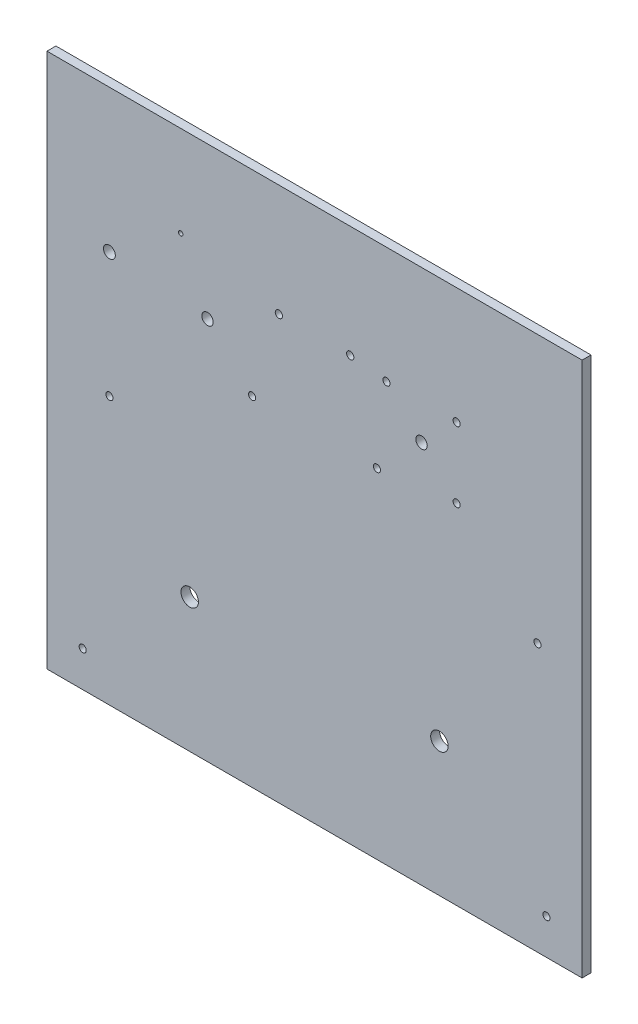
ISO-10303-21;
HEADER;
FILE_DESCRIPTION(('STEP AP214'),'2;1');
FILE_NAME('part.step','',(''),(''),'','','');
FILE_SCHEMA(('AUTOMOTIVE_DESIGN { 1 0 10303 214 1 1 1 1 }'));
ENDSEC;
DATA;
#1=APPLICATION_CONTEXT('core data for automotive mechanical design processes');
#2=APPLICATION_PROTOCOL_DEFINITION('international standard','automotive_design',2000,#1);
#3=PRODUCT_CONTEXT('',#1,'mechanical');
#4=PRODUCT('Part','Part','',(#3));
#5=PRODUCT_RELATED_PRODUCT_CATEGORY('part','',(#4));
#6=PRODUCT_DEFINITION_FORMATION('','',#4);
#7=PRODUCT_DEFINITION_CONTEXT('part definition',#1,'design');
#8=PRODUCT_DEFINITION('design','',#6,#7);
#9=PRODUCT_DEFINITION_SHAPE('','',#8);
#10=(LENGTH_UNIT() NAMED_UNIT(*) SI_UNIT(.MILLI.,.METRE.));
#11=(NAMED_UNIT(*) PLANE_ANGLE_UNIT() SI_UNIT($,.RADIAN.));
#12=(NAMED_UNIT(*) SI_UNIT($,.STERADIAN.) SOLID_ANGLE_UNIT());
#13=UNCERTAINTY_MEASURE_WITH_UNIT(LENGTH_MEASURE(1.E-05),#10,'distance_accuracy_value','');
#14=(GEOMETRIC_REPRESENTATION_CONTEXT(3) GLOBAL_UNCERTAINTY_ASSIGNED_CONTEXT((#13)) GLOBAL_UNIT_ASSIGNED_CONTEXT((#10,
#11,#12)) REPRESENTATION_CONTEXT('',''));
#15=CARTESIAN_POINT('',(0.,0.,0.));
#16=DIRECTION('',(0.,0.,1.));
#17=DIRECTION('',(1.,0.,0.));
#18=AXIS2_PLACEMENT_3D('',#15,#16,#17);
#19=CARTESIAN_POINT('',(190.5,0.,6.35));
#20=DIRECTION('',(0.,0.,1.));
#21=DIRECTION('',(1.,0.,0.));
#22=AXIS2_PLACEMENT_3D('',#19,#20,#21);
#23=PLANE('',#22);
#24=CARTESIAN_POINT('',(-146.05,279.4,6.35));
#25=DIRECTION('',(0.,0.,1.));
#26=DIRECTION('',(1.,0.,0.));
#27=AXIS2_PLACEMENT_3D('',#24,#25,#26);
#28=CIRCLE('',#27,4.21639999999998);
#29=CARTESIAN_POINT('',(-141.8336,279.4,6.35));
#30=VERTEX_POINT('',#29);
#31=EDGE_CURVE('E212',#30,#30,#28,.T.);
#32=ORIENTED_EDGE('',*,*,#31,.F.);
#33=EDGE_LOOP('',(#32));
#34=FACE_BOUND('',#33,.T.);
#35=CARTESIAN_POINT('',(51.1999999999998,298.05,6.35));
#36=DIRECTION('',(0.,0.,1.));
#37=DIRECTION('',(1.,0.,0.));
#38=AXIS2_PLACEMENT_3D('',#35,#36,#37);
#39=CIRCLE('',#38,2.53999999999996);
#40=CARTESIAN_POINT('',(53.7399999999997,298.05,6.35));
#41=VERTEX_POINT('',#40);
#42=EDGE_CURVE('E195',#41,#41,#39,.T.);
#43=ORIENTED_EDGE('',*,*,#42,.F.);
#44=EDGE_LOOP('',(#43));
#45=FACE_BOUND('',#44,.T.);
#46=CARTESIAN_POINT('',(-44.45,241.3,6.35));
#47=DIRECTION('',(0.,0.,1.));
#48=DIRECTION('',(-1.,0.,0.));
#49=AXIS2_PLACEMENT_3D('',#46,#47,#48);
#50=CIRCLE('',#49,2.54000000000002);
#51=CARTESIAN_POINT('',(-46.99,241.3,6.35));
#52=VERTEX_POINT('',#51);
#53=EDGE_CURVE('E183',#52,#52,#50,.T.);
#54=ORIENTED_EDGE('',*,*,#53,.F.);
#55=EDGE_LOOP('',(#54));
#56=FACE_BOUND('',#55,.T.);
#57=CARTESIAN_POINT('',(-146.05,190.5,6.35));
#58=DIRECTION('',(0.,0.,1.));
#59=DIRECTION('',(-1.,0.,0.));
#60=AXIS2_PLACEMENT_3D('',#57,#58,#59);
#61=CIRCLE('',#60,2.53999999999995);
#62=CARTESIAN_POINT('',(-148.59,190.5,6.35));
#63=VERTEX_POINT('',#62);
#64=EDGE_CURVE('E171',#63,#63,#61,.T.);
#65=ORIENTED_EDGE('',*,*,#64,.F.);
#66=EDGE_LOOP('',(#65));
#67=FACE_BOUND('',#66,.T.);
#68=CARTESIAN_POINT('',(158.75,190.5,6.35));
#69=DIRECTION('',(0.,0.,1.));
#70=DIRECTION('',(1.,0.,0.));
#71=AXIS2_PLACEMENT_3D('',#68,#69,#70);
#72=CIRCLE('',#71,2.53999999999998);
#73=CARTESIAN_POINT('',(161.29,190.5,6.35));
#74=VERTEX_POINT('',#73);
#75=EDGE_CURVE('E159',#74,#74,#72,.T.);
#76=ORIENTED_EDGE('',*,*,#75,.F.);
#77=EDGE_LOOP('',(#76));
#78=FACE_BOUND('',#77,.T.);
#79=CARTESIAN_POINT('',(101.2,298.05,6.35));
#80=DIRECTION('',(0.,0.,1.));
#81=DIRECTION('',(1.,0.,0.));
#82=AXIS2_PLACEMENT_3D('',#79,#80,#81);
#83=CIRCLE('',#82,2.53999999999998);
#84=CARTESIAN_POINT('',(103.74,298.05,6.35));
#85=VERTEX_POINT('',#84);
#86=EDGE_CURVE('E147',#85,#85,#83,.T.);
#87=ORIENTED_EDGE('',*,*,#86,.F.);
#88=EDGE_LOOP('',(#87));
#89=FACE_BOUND('',#88,.T.);
#90=CARTESIAN_POINT('',(44.4500000000001,241.3,6.35));
#91=DIRECTION('',(0.,0.,1.));
#92=DIRECTION('',(1.,0.,0.));
#93=AXIS2_PLACEMENT_3D('',#90,#91,#92);
#94=CIRCLE('',#93,2.54000000000002);
#95=CARTESIAN_POINT('',(46.9900000000001,241.3,6.35));
#96=VERTEX_POINT('',#95);
#97=EDGE_CURVE('E135',#96,#96,#94,.T.);
#98=ORIENTED_EDGE('',*,*,#97,.F.);
#99=EDGE_LOOP('',(#98));
#100=FACE_BOUND('',#99,.T.);
#101=CARTESIAN_POINT('',(76.1999999999998,273.05,6.35));
#102=DIRECTION('',(0.,0.,1.));
#103=DIRECTION('',(1.,0.,0.));
#104=AXIS2_PLACEMENT_3D('',#101,#102,#103);
#105=CIRCLE('',#104,4.06400000000001);
#106=CARTESIAN_POINT('',(80.2639999999998,273.05,6.35));
#107=VERTEX_POINT('',#106);
#108=EDGE_CURVE('E123',#107,#107,#105,.T.);
#109=ORIENTED_EDGE('',*,*,#108,.F.);
#110=EDGE_LOOP('',(#109));
#111=FACE_BOUND('',#110,.T.);
#112=CARTESIAN_POINT('',(-25.4,301.364999999996,6.35));
#113=DIRECTION('',(0.,0.,1.));
#114=DIRECTION('',(1.,0.,0.));
#115=AXIS2_PLACEMENT_3D('',#112,#113,#114);
#116=CIRCLE('',#115,2.5796875);
#117=CARTESIAN_POINT('',(-22.8203125,301.364999999996,6.35));
#118=VERTEX_POINT('',#117);
#119=EDGE_CURVE('E102',#118,#118,#116,.T.);
#120=ORIENTED_EDGE('',*,*,#119,.F.);
#121=EDGE_LOOP('',(#120));
#122=FACE_BOUND('',#121,.T.);
#123=DIRECTION('',(0.,1.,0.));
#124=VECTOR('',#123,1.);
#125=CARTESIAN_POINT('',(190.5,381.,6.35));
#126=LINE('',#125,#124);
#127=CARTESIAN_POINT('',(190.5,0.,6.35));
#128=VERTEX_POINT('',#127);
#129=CARTESIAN_POINT('',(190.5,381.,6.35));
#130=VERTEX_POINT('',#129);
#131=EDGE_CURVE('E87',#128,#130,#126,.T.);
#132=ORIENTED_EDGE('',*,*,#131,.T.);
#133=DIRECTION('',(-1.,0.,0.));
#134=VECTOR('',#133,1.);
#135=CARTESIAN_POINT('',(190.5,381.,6.35));
#136=LINE('',#135,#134);
#137=CARTESIAN_POINT('',(-190.5,381.,6.35));
#138=VERTEX_POINT('',#137);
#139=EDGE_CURVE('E82',#130,#138,#136,.T.);
#140=ORIENTED_EDGE('',*,*,#139,.T.);
#141=DIRECTION('',(0.,-1.,0.));
#142=VECTOR('',#141,1.);
#143=CARTESIAN_POINT('',(-190.5,381.,6.35));
#144=LINE('',#143,#142);
#145=CARTESIAN_POINT('',(-190.5,0.,6.35));
#146=VERTEX_POINT('',#145);
#147=EDGE_CURVE('E85',#138,#146,#144,.T.);
#148=ORIENTED_EDGE('',*,*,#147,.T.);
#149=DIRECTION('',(1.,0.,0.));
#150=VECTOR('',#149,1.);
#151=CARTESIAN_POINT('',(-190.5,0.,6.35));
#152=LINE('',#151,#150);
#153=EDGE_CURVE('E52',#146,#128,#152,.T.);
#154=ORIENTED_EDGE('',*,*,#153,.T.);
#155=EDGE_LOOP('',(#132,#140,#148,#154));
#156=FACE_BOUND('',#155,.T.);
#157=CARTESIAN_POINT('',(25.4,301.364999999996,6.35));
#158=DIRECTION('',(0.,0.,1.));
#159=DIRECTION('',(1.,0.,0.));
#160=AXIS2_PLACEMENT_3D('',#157,#158,#159);
#161=CIRCLE('',#160,2.57968749999999);
#162=CARTESIAN_POINT('',(27.9796875,301.364999999996,6.35));
#163=VERTEX_POINT('',#162);
#164=EDGE_CURVE('E117',#163,#163,#161,.T.);
#165=ORIENTED_EDGE('',*,*,#164,.F.);
#166=EDGE_LOOP('',(#165));
#167=FACE_BOUND('',#166,.T.);
#168=CARTESIAN_POINT('',(88.9000000000001,95.2499999999999,6.35));
#169=DIRECTION('',(0.,0.,1.));
#170=DIRECTION('',(1.,0.,0.));
#171=AXIS2_PLACEMENT_3D('',#168,#169,#170);
#172=CIRCLE('',#171,6.22299999999999);
#173=CARTESIAN_POINT('',(95.1230000000001,95.2499999999999,6.35));
#174=VERTEX_POINT('',#173);
#175=EDGE_CURVE('E129',#174,#174,#172,.T.);
#176=ORIENTED_EDGE('',*,*,#175,.F.);
#177=EDGE_LOOP('',(#176));
#178=FACE_BOUND('',#177,.T.);
#179=CARTESIAN_POINT('',(-165.1,25.3999999999985,6.35));
#180=DIRECTION('',(0.,0.,1.));
#181=DIRECTION('',(-1.,0.,0.));
#182=AXIS2_PLACEMENT_3D('',#179,#180,#181);
#183=CIRCLE('',#182,2.53999999999998);
#184=CARTESIAN_POINT('',(-167.64,25.3999999999985,6.35));
#185=VERTEX_POINT('',#184);
#186=EDGE_CURVE('E141',#185,#185,#183,.T.);
#187=ORIENTED_EDGE('',*,*,#186,.F.);
#188=EDGE_LOOP('',(#187));
#189=FACE_BOUND('',#188,.T.);
#190=CARTESIAN_POINT('',(165.1,25.3999999999986,6.35));
#191=DIRECTION('',(0.,0.,1.));
#192=DIRECTION('',(1.,0.,0.));
#193=AXIS2_PLACEMENT_3D('',#190,#191,#192);
#194=CIRCLE('',#193,2.53999999999998);
#195=CARTESIAN_POINT('',(167.64,25.3999999999986,6.35));
#196=VERTEX_POINT('',#195);
#197=EDGE_CURVE('E153',#196,#196,#194,.T.);
#198=ORIENTED_EDGE('',*,*,#197,.F.);
#199=EDGE_LOOP('',(#198));
#200=FACE_BOUND('',#199,.T.);
#201=CARTESIAN_POINT('',(-88.9,95.2499999999999,6.35));
#202=DIRECTION('',(0.,0.,1.));
#203=DIRECTION('',(-1.,0.,0.));
#204=AXIS2_PLACEMENT_3D('',#201,#202,#203);
#205=CIRCLE('',#204,6.22299999999999);
#206=CARTESIAN_POINT('',(-95.123,95.2499999999999,6.35));
#207=VERTEX_POINT('',#206);
#208=EDGE_CURVE('E165',#207,#207,#205,.T.);
#209=ORIENTED_EDGE('',*,*,#208,.F.);
#210=EDGE_LOOP('',(#209));
#211=FACE_BOUND('',#210,.T.);
#212=CARTESIAN_POINT('',(101.2,248.05,6.35));
#213=DIRECTION('',(0.,0.,1.));
#214=DIRECTION('',(1.,0.,0.));
#215=AXIS2_PLACEMENT_3D('',#212,#213,#214);
#216=CIRCLE('',#215,2.53999999999998);
#217=CARTESIAN_POINT('',(103.74,248.05,6.35));
#218=VERTEX_POINT('',#217);
#219=EDGE_CURVE('E177',#218,#218,#216,.T.);
#220=ORIENTED_EDGE('',*,*,#219,.F.);
#221=EDGE_LOOP('',(#220));
#222=FACE_BOUND('',#221,.T.);
#223=CARTESIAN_POINT('',(-76.2,273.05,6.35));
#224=DIRECTION('',(0.,0.,1.));
#225=DIRECTION('',(-1.,0.,0.));
#226=AXIS2_PLACEMENT_3D('',#223,#224,#225);
#227=CIRCLE('',#226,4.06400000000001);
#228=CARTESIAN_POINT('',(-80.264,273.05,6.35));
#229=VERTEX_POINT('',#228);
#230=EDGE_CURVE('E189',#229,#229,#227,.T.);
#231=ORIENTED_EDGE('',*,*,#230,.F.);
#232=EDGE_LOOP('',(#231));
#233=FACE_BOUND('',#232,.T.);
#234=CARTESIAN_POINT('',(-95.25,316.23,6.35));
#235=DIRECTION('',(0.,0.,1.));
#236=DIRECTION('',(1.,0.,0.));
#237=AXIS2_PLACEMENT_3D('',#234,#235,#236);
#238=CIRCLE('',#237,1.5875);
#239=CARTESIAN_POINT('',(-93.6625,316.23,6.35));
#240=VERTEX_POINT('',#239);
#241=EDGE_CURVE('E201',#240,#240,#238,.T.);
#242=ORIENTED_EDGE('',*,*,#241,.F.);
#243=EDGE_LOOP('',(#242));
#244=FACE_BOUND('',#243,.T.);
#245=ADVANCED_FACE('F35',(#34,#45,#56,#67,#78,#89,#100,#111,#122,#156,#167,#178,#189,#200,#211,
#222,#233,#244),#23,.T.);
#246=CARTESIAN_POINT('',(190.5,0.,0.));
#247=DIRECTION('',(0.,0.,1.));
#248=DIRECTION('',(1.,0.,0.));
#249=AXIS2_PLACEMENT_3D('',#246,#247,#248);
#250=PLANE('',#249);
#251=CARTESIAN_POINT('',(-146.05,279.4,0.));
#252=DIRECTION('',(0.,0.,1.));
#253=DIRECTION('',(1.,0.,0.));
#254=AXIS2_PLACEMENT_3D('',#251,#252,#253);
#255=CIRCLE('',#254,4.21640000000001);
#256=CARTESIAN_POINT('',(-141.8336,279.4,0.));
#257=VERTEX_POINT('',#256);
#258=EDGE_CURVE('E207',#257,#257,#255,.T.);
#259=ORIENTED_EDGE('',*,*,#258,.T.);
#260=EDGE_LOOP('',(#259));
#261=FACE_BOUND('',#260,.T.);
#262=CARTESIAN_POINT('',(51.1999999999998,298.05,0.));
#263=DIRECTION('',(0.,0.,1.));
#264=DIRECTION('',(1.,0.,0.));
#265=AXIS2_PLACEMENT_3D('',#262,#263,#264);
#266=CIRCLE('',#265,2.53999999999996);
#267=CARTESIAN_POINT('',(53.7399999999997,298.05,0.));
#268=VERTEX_POINT('',#267);
#269=EDGE_CURVE('E198',#268,#268,#266,.T.);
#270=ORIENTED_EDGE('',*,*,#269,.T.);
#271=EDGE_LOOP('',(#270));
#272=FACE_BOUND('',#271,.T.);
#273=CARTESIAN_POINT('',(-44.45,241.3,0.));
#274=DIRECTION('',(0.,0.,1.));
#275=DIRECTION('',(-1.,0.,0.));
#276=AXIS2_PLACEMENT_3D('',#273,#274,#275);
#277=CIRCLE('',#276,2.54000000000002);
#278=CARTESIAN_POINT('',(-46.99,241.3,0.));
#279=VERTEX_POINT('',#278);
#280=EDGE_CURVE('E186',#279,#279,#277,.T.);
#281=ORIENTED_EDGE('',*,*,#280,.T.);
#282=EDGE_LOOP('',(#281));
#283=FACE_BOUND('',#282,.T.);
#284=CARTESIAN_POINT('',(-146.05,190.5,0.));
#285=DIRECTION('',(0.,0.,1.));
#286=DIRECTION('',(-1.,0.,0.));
#287=AXIS2_PLACEMENT_3D('',#284,#285,#286);
#288=CIRCLE('',#287,2.53999999999995);
#289=CARTESIAN_POINT('',(-148.59,190.5,0.));
#290=VERTEX_POINT('',#289);
#291=EDGE_CURVE('E174',#290,#290,#288,.T.);
#292=ORIENTED_EDGE('',*,*,#291,.T.);
#293=EDGE_LOOP('',(#292));
#294=FACE_BOUND('',#293,.T.);
#295=CARTESIAN_POINT('',(158.75,190.5,0.));
#296=DIRECTION('',(0.,0.,1.));
#297=DIRECTION('',(1.,0.,0.));
#298=AXIS2_PLACEMENT_3D('',#295,#296,#297);
#299=CIRCLE('',#298,2.53999999999998);
#300=CARTESIAN_POINT('',(161.29,190.5,0.));
#301=VERTEX_POINT('',#300);
#302=EDGE_CURVE('E162',#301,#301,#299,.T.);
#303=ORIENTED_EDGE('',*,*,#302,.T.);
#304=EDGE_LOOP('',(#303));
#305=FACE_BOUND('',#304,.T.);
#306=CARTESIAN_POINT('',(101.2,298.05,0.));
#307=DIRECTION('',(0.,0.,1.));
#308=DIRECTION('',(1.,0.,0.));
#309=AXIS2_PLACEMENT_3D('',#306,#307,#308);
#310=CIRCLE('',#309,2.53999999999998);
#311=CARTESIAN_POINT('',(103.74,298.05,0.));
#312=VERTEX_POINT('',#311);
#313=EDGE_CURVE('E150',#312,#312,#310,.T.);
#314=ORIENTED_EDGE('',*,*,#313,.T.);
#315=EDGE_LOOP('',(#314));
#316=FACE_BOUND('',#315,.T.);
#317=CARTESIAN_POINT('',(44.4500000000001,241.3,0.));
#318=DIRECTION('',(0.,0.,1.));
#319=DIRECTION('',(1.,0.,0.));
#320=AXIS2_PLACEMENT_3D('',#317,#318,#319);
#321=CIRCLE('',#320,2.54000000000002);
#322=CARTESIAN_POINT('',(46.9900000000001,241.3,0.));
#323=VERTEX_POINT('',#322);
#324=EDGE_CURVE('E138',#323,#323,#321,.T.);
#325=ORIENTED_EDGE('',*,*,#324,.T.);
#326=EDGE_LOOP('',(#325));
#327=FACE_BOUND('',#326,.T.);
#328=CARTESIAN_POINT('',(76.1999999999998,273.05,0.));
#329=DIRECTION('',(0.,0.,1.));
#330=DIRECTION('',(1.,0.,0.));
#331=AXIS2_PLACEMENT_3D('',#328,#329,#330);
#332=CIRCLE('',#331,4.06400000000001);
#333=CARTESIAN_POINT('',(80.2639999999998,273.05,0.));
#334=VERTEX_POINT('',#333);
#335=EDGE_CURVE('E126',#334,#334,#332,.T.);
#336=ORIENTED_EDGE('',*,*,#335,.T.);
#337=EDGE_LOOP('',(#336));
#338=FACE_BOUND('',#337,.T.);
#339=CARTESIAN_POINT('',(-25.4,301.364999999996,0.));
#340=DIRECTION('',(0.,0.,1.));
#341=DIRECTION('',(1.,0.,0.));
#342=AXIS2_PLACEMENT_3D('',#339,#340,#341);
#343=CIRCLE('',#342,2.5796875);
#344=CARTESIAN_POINT('',(-22.8203125,301.364999999996,0.));
#345=VERTEX_POINT('',#344);
#346=EDGE_CURVE('E114',#345,#345,#343,.T.);
#347=ORIENTED_EDGE('',*,*,#346,.T.);
#348=EDGE_LOOP('',(#347));
#349=FACE_BOUND('',#348,.T.);
#350=DIRECTION('',(0.,1.,0.));
#351=VECTOR('',#350,1.);
#352=CARTESIAN_POINT('',(190.5,381.,0.));
#353=LINE('',#352,#351);
#354=CARTESIAN_POINT('',(190.5,0.,0.));
#355=VERTEX_POINT('',#354);
#356=CARTESIAN_POINT('',(190.5,381.,0.));
#357=VERTEX_POINT('',#356);
#358=EDGE_CURVE('E99',#355,#357,#353,.T.);
#359=ORIENTED_EDGE('',*,*,#358,.F.);
#360=DIRECTION('',(1.,0.,0.));
#361=VECTOR('',#360,1.);
#362=CARTESIAN_POINT('',(-190.5,0.,0.));
#363=LINE('',#362,#361);
#364=CARTESIAN_POINT('',(-190.5,0.,0.));
#365=VERTEX_POINT('',#364);
#366=EDGE_CURVE('E75',#365,#355,#363,.T.);
#367=ORIENTED_EDGE('',*,*,#366,.F.);
#368=DIRECTION('',(0.,-1.,0.));
#369=VECTOR('',#368,1.);
#370=CARTESIAN_POINT('',(-190.5,381.,0.));
#371=LINE('',#370,#369);
#372=CARTESIAN_POINT('',(-190.5,381.,0.));
#373=VERTEX_POINT('',#372);
#374=EDGE_CURVE('E69',#373,#365,#371,.T.);
#375=ORIENTED_EDGE('',*,*,#374,.F.);
#376=DIRECTION('',(-1.,0.,0.));
#377=VECTOR('',#376,1.);
#378=CARTESIAN_POINT('',(190.5,381.,0.));
#379=LINE('',#378,#377);
#380=EDGE_CURVE('E91',#357,#373,#379,.T.);
#381=ORIENTED_EDGE('',*,*,#380,.F.);
#382=EDGE_LOOP('',(#359,#367,#375,#381));
#383=FACE_BOUND('',#382,.T.);
#384=CARTESIAN_POINT('',(25.4,301.364999999996,0.));
#385=DIRECTION('',(0.,0.,1.));
#386=DIRECTION('',(1.,0.,0.));
#387=AXIS2_PLACEMENT_3D('',#384,#385,#386);
#388=CIRCLE('',#387,2.57968749999999);
#389=CARTESIAN_POINT('',(27.9796875,301.364999999996,0.));
#390=VERTEX_POINT('',#389);
#391=EDGE_CURVE('E120',#390,#390,#388,.T.);
#392=ORIENTED_EDGE('',*,*,#391,.T.);
#393=EDGE_LOOP('',(#392));
#394=FACE_BOUND('',#393,.T.);
#395=CARTESIAN_POINT('',(88.9000000000001,95.2499999999999,0.));
#396=DIRECTION('',(0.,0.,1.));
#397=DIRECTION('',(1.,0.,0.));
#398=AXIS2_PLACEMENT_3D('',#395,#396,#397);
#399=CIRCLE('',#398,6.22299999999999);
#400=CARTESIAN_POINT('',(95.1230000000001,95.2499999999999,0.));
#401=VERTEX_POINT('',#400);
#402=EDGE_CURVE('E132',#401,#401,#399,.T.);
#403=ORIENTED_EDGE('',*,*,#402,.T.);
#404=EDGE_LOOP('',(#403));
#405=FACE_BOUND('',#404,.T.);
#406=CARTESIAN_POINT('',(-165.1,25.3999999999985,0.));
#407=DIRECTION('',(0.,0.,1.));
#408=DIRECTION('',(-1.,0.,0.));
#409=AXIS2_PLACEMENT_3D('',#406,#407,#408);
#410=CIRCLE('',#409,2.53999999999998);
#411=CARTESIAN_POINT('',(-167.64,25.3999999999985,0.));
#412=VERTEX_POINT('',#411);
#413=EDGE_CURVE('E144',#412,#412,#410,.T.);
#414=ORIENTED_EDGE('',*,*,#413,.T.);
#415=EDGE_LOOP('',(#414));
#416=FACE_BOUND('',#415,.T.);
#417=CARTESIAN_POINT('',(165.1,25.3999999999986,0.));
#418=DIRECTION('',(0.,0.,1.));
#419=DIRECTION('',(1.,0.,0.));
#420=AXIS2_PLACEMENT_3D('',#417,#418,#419);
#421=CIRCLE('',#420,2.53999999999998);
#422=CARTESIAN_POINT('',(167.64,25.3999999999986,0.));
#423=VERTEX_POINT('',#422);
#424=EDGE_CURVE('E156',#423,#423,#421,.T.);
#425=ORIENTED_EDGE('',*,*,#424,.T.);
#426=EDGE_LOOP('',(#425));
#427=FACE_BOUND('',#426,.T.);
#428=CARTESIAN_POINT('',(-88.9,95.2499999999999,0.));
#429=DIRECTION('',(0.,0.,1.));
#430=DIRECTION('',(-1.,0.,0.));
#431=AXIS2_PLACEMENT_3D('',#428,#429,#430);
#432=CIRCLE('',#431,6.22299999999999);
#433=CARTESIAN_POINT('',(-95.123,95.2499999999999,0.));
#434=VERTEX_POINT('',#433);
#435=EDGE_CURVE('E168',#434,#434,#432,.T.);
#436=ORIENTED_EDGE('',*,*,#435,.T.);
#437=EDGE_LOOP('',(#436));
#438=FACE_BOUND('',#437,.T.);
#439=CARTESIAN_POINT('',(101.2,248.05,0.));
#440=DIRECTION('',(0.,0.,1.));
#441=DIRECTION('',(1.,0.,0.));
#442=AXIS2_PLACEMENT_3D('',#439,#440,#441);
#443=CIRCLE('',#442,2.53999999999998);
#444=CARTESIAN_POINT('',(103.74,248.05,0.));
#445=VERTEX_POINT('',#444);
#446=EDGE_CURVE('E180',#445,#445,#443,.T.);
#447=ORIENTED_EDGE('',*,*,#446,.T.);
#448=EDGE_LOOP('',(#447));
#449=FACE_BOUND('',#448,.T.);
#450=CARTESIAN_POINT('',(-76.2,273.05,0.));
#451=DIRECTION('',(0.,0.,1.));
#452=DIRECTION('',(-1.,0.,0.));
#453=AXIS2_PLACEMENT_3D('',#450,#451,#452);
#454=CIRCLE('',#453,4.06400000000001);
#455=CARTESIAN_POINT('',(-80.264,273.05,0.));
#456=VERTEX_POINT('',#455);
#457=EDGE_CURVE('E192',#456,#456,#454,.T.);
#458=ORIENTED_EDGE('',*,*,#457,.T.);
#459=EDGE_LOOP('',(#458));
#460=FACE_BOUND('',#459,.T.);
#461=CARTESIAN_POINT('',(-95.25,316.23,0.));
#462=DIRECTION('',(0.,0.,1.));
#463=DIRECTION('',(1.,0.,0.));
#464=AXIS2_PLACEMENT_3D('',#461,#462,#463);
#465=CIRCLE('',#464,1.5875);
#466=CARTESIAN_POINT('',(-93.6625,316.23,0.));
#467=VERTEX_POINT('',#466);
#468=EDGE_CURVE('E204',#467,#467,#465,.T.);
#469=ORIENTED_EDGE('',*,*,#468,.T.);
#470=EDGE_LOOP('',(#469));
#471=FACE_BOUND('',#470,.T.);
#472=ADVANCED_FACE('F110',(#261,#272,#283,#294,#305,#316,#327,#338,#349,#383,#394,#405,#416,
#427,#438,#449,#460,#471),#250,.F.);
#473=CARTESIAN_POINT('',(190.5,381.,6.35));
#474=DIRECTION('',(-1.,0.,0.));
#475=DIRECTION('',(0.,-1.,0.));
#476=AXIS2_PLACEMENT_3D('',#473,#474,#475);
#477=PLANE('',#476);
#478=ORIENTED_EDGE('',*,*,#358,.T.);
#479=DIRECTION('',(0.,0.,-1.));
#480=VECTOR('',#479,1.);
#481=CARTESIAN_POINT('',(190.5,381.,6.35));
#482=LINE('',#481,#480);
#483=EDGE_CURVE('E11',#130,#357,#482,.T.);
#484=ORIENTED_EDGE('',*,*,#483,.F.);
#485=ORIENTED_EDGE('',*,*,#131,.F.);
#486=DIRECTION('',(0.,0.,-1.));
#487=VECTOR('',#486,1.);
#488=CARTESIAN_POINT('',(190.5,0.,6.35));
#489=LINE('',#488,#487);
#490=EDGE_CURVE('E95',#128,#355,#489,.T.);
#491=ORIENTED_EDGE('',*,*,#490,.T.);
#492=EDGE_LOOP('',(#478,#484,#485,#491));
#493=FACE_BOUND('',#492,.T.);
#494=ADVANCED_FACE('F37',(#493),#477,.F.);
#495=CARTESIAN_POINT('',(190.5,381.,6.35));
#496=DIRECTION('',(0.,-1.,0.));
#497=DIRECTION('',(1.,0.,0.));
#498=AXIS2_PLACEMENT_3D('',#495,#496,#497);
#499=PLANE('',#498);
#500=ORIENTED_EDGE('',*,*,#380,.T.);
#501=DIRECTION('',(0.,0.,-1.));
#502=VECTOR('',#501,1.);
#503=CARTESIAN_POINT('',(-190.5,381.,6.35));
#504=LINE('',#503,#502);
#505=EDGE_CURVE('E44',#138,#373,#504,.T.);
#506=ORIENTED_EDGE('',*,*,#505,.F.);
#507=ORIENTED_EDGE('',*,*,#139,.F.);
#508=ORIENTED_EDGE('',*,*,#483,.T.);
#509=EDGE_LOOP('',(#500,#506,#507,#508));
#510=FACE_BOUND('',#509,.T.);
#511=ADVANCED_FACE('F90',(#510),#499,.F.);
#512=CARTESIAN_POINT('',(-190.5,381.,6.35));
#513=DIRECTION('',(1.,0.,0.));
#514=DIRECTION('',(0.,1.,0.));
#515=AXIS2_PLACEMENT_3D('',#512,#513,#514);
#516=PLANE('',#515);
#517=ORIENTED_EDGE('',*,*,#374,.T.);
#518=DIRECTION('',(0.,0.,-1.));
#519=VECTOR('',#518,1.);
#520=CARTESIAN_POINT('',(-190.5,0.,6.35));
#521=LINE('',#520,#519);
#522=EDGE_CURVE('E92',#146,#365,#521,.T.);
#523=ORIENTED_EDGE('',*,*,#522,.F.);
#524=ORIENTED_EDGE('',*,*,#147,.F.);
#525=ORIENTED_EDGE('',*,*,#505,.T.);
#526=EDGE_LOOP('',(#517,#523,#524,#525));
#527=FACE_BOUND('',#526,.T.);
#528=ADVANCED_FACE('F93',(#527),#516,.F.);
#529=CARTESIAN_POINT('',(-190.5,0.,6.35));
#530=DIRECTION('',(0.,1.,0.));
#531=DIRECTION('',(0.,0.,1.));
#532=AXIS2_PLACEMENT_3D('',#529,#530,#531);
#533=PLANE('',#532);
#534=ORIENTED_EDGE('',*,*,#366,.T.);
#535=ORIENTED_EDGE('',*,*,#490,.F.);
#536=ORIENTED_EDGE('',*,*,#153,.F.);
#537=ORIENTED_EDGE('',*,*,#522,.T.);
#538=EDGE_LOOP('',(#534,#535,#536,#537));
#539=FACE_BOUND('',#538,.T.);
#540=ADVANCED_FACE('F107',(#539),#533,.F.);
#541=CARTESIAN_POINT('',(-25.4,301.364999999996,6.35));
#542=DIRECTION('',(0.,0.,-1.));
#543=DIRECTION('',(-1.,0.,0.));
#544=AXIS2_PLACEMENT_3D('',#541,#542,#543);
#545=CYLINDRICAL_SURFACE('',#544,2.5796875);
#546=ORIENTED_EDGE('',*,*,#119,.T.);
#547=EDGE_LOOP('',(#546));
#548=FACE_BOUND('',#547,.T.);
#549=ORIENTED_EDGE('',*,*,#346,.F.);
#550=EDGE_LOOP('',(#549));
#551=FACE_BOUND('',#550,.T.);
#552=ADVANCED_FACE('F237',(#548,#551),#545,.F.);
#553=CARTESIAN_POINT('',(25.4,301.364999999996,6.35));
#554=DIRECTION('',(0.,0.,-1.));
#555=DIRECTION('',(-1.,0.,0.));
#556=AXIS2_PLACEMENT_3D('',#553,#554,#555);
#557=CYLINDRICAL_SURFACE('',#556,2.57968749999999);
#558=ORIENTED_EDGE('',*,*,#164,.T.);
#559=EDGE_LOOP('',(#558));
#560=FACE_BOUND('',#559,.T.);
#561=ORIENTED_EDGE('',*,*,#391,.F.);
#562=EDGE_LOOP('',(#561));
#563=FACE_BOUND('',#562,.T.);
#564=ADVANCED_FACE('F240',(#560,#563),#557,.F.);
#565=CARTESIAN_POINT('',(76.1999999999998,273.05,6.35));
#566=DIRECTION('',(0.,0.,-1.));
#567=DIRECTION('',(-1.,0.,0.));
#568=AXIS2_PLACEMENT_3D('',#565,#566,#567);
#569=CYLINDRICAL_SURFACE('',#568,4.06400000000001);
#570=ORIENTED_EDGE('',*,*,#108,.T.);
#571=EDGE_LOOP('',(#570));
#572=FACE_BOUND('',#571,.T.);
#573=ORIENTED_EDGE('',*,*,#335,.F.);
#574=EDGE_LOOP('',(#573));
#575=FACE_BOUND('',#574,.T.);
#576=ADVANCED_FACE('F278',(#572,#575),#569,.F.);
#577=CARTESIAN_POINT('',(88.9000000000001,95.2499999999999,6.35));
#578=DIRECTION('',(0.,0.,-1.));
#579=DIRECTION('',(-1.,0.,0.));
#580=AXIS2_PLACEMENT_3D('',#577,#578,#579);
#581=CYLINDRICAL_SURFACE('',#580,6.22299999999999);
#582=ORIENTED_EDGE('',*,*,#175,.T.);
#583=EDGE_LOOP('',(#582));
#584=FACE_BOUND('',#583,.T.);
#585=ORIENTED_EDGE('',*,*,#402,.F.);
#586=EDGE_LOOP('',(#585));
#587=FACE_BOUND('',#586,.T.);
#588=ADVANCED_FACE('F286',(#584,#587),#581,.F.);
#589=CARTESIAN_POINT('',(44.4500000000001,241.3,6.35));
#590=DIRECTION('',(0.,0.,-1.));
#591=DIRECTION('',(-1.,0.,0.));
#592=AXIS2_PLACEMENT_3D('',#589,#590,#591);
#593=CYLINDRICAL_SURFACE('',#592,2.54000000000002);
#594=ORIENTED_EDGE('',*,*,#97,.T.);
#595=EDGE_LOOP('',(#594));
#596=FACE_BOUND('',#595,.T.);
#597=ORIENTED_EDGE('',*,*,#324,.F.);
#598=EDGE_LOOP('',(#597));
#599=FACE_BOUND('',#598,.T.);
#600=ADVANCED_FACE('F294',(#596,#599),#593,.F.);
#601=CARTESIAN_POINT('',(-165.1,25.3999999999985,6.35));
#602=DIRECTION('',(0.,0.,-1.));
#603=DIRECTION('',(-1.,0.,0.));
#604=AXIS2_PLACEMENT_3D('',#601,#602,#603);
#605=CYLINDRICAL_SURFACE('',#604,2.53999999999998);
#606=ORIENTED_EDGE('',*,*,#186,.T.);
#607=EDGE_LOOP('',(#606));
#608=FACE_BOUND('',#607,.T.);
#609=ORIENTED_EDGE('',*,*,#413,.F.);
#610=EDGE_LOOP('',(#609));
#611=FACE_BOUND('',#610,.T.);
#612=ADVANCED_FACE('F302',(#608,#611),#605,.F.);
#613=CARTESIAN_POINT('',(101.2,298.05,6.35));
#614=DIRECTION('',(0.,0.,-1.));
#615=DIRECTION('',(-1.,0.,0.));
#616=AXIS2_PLACEMENT_3D('',#613,#614,#615);
#617=CYLINDRICAL_SURFACE('',#616,2.53999999999998);
#618=ORIENTED_EDGE('',*,*,#86,.T.);
#619=EDGE_LOOP('',(#618));
#620=FACE_BOUND('',#619,.T.);
#621=ORIENTED_EDGE('',*,*,#313,.F.);
#622=EDGE_LOOP('',(#621));
#623=FACE_BOUND('',#622,.T.);
#624=ADVANCED_FACE('F310',(#620,#623),#617,.F.);
#625=CARTESIAN_POINT('',(165.1,25.3999999999986,6.35));
#626=DIRECTION('',(0.,0.,-1.));
#627=DIRECTION('',(-1.,0.,0.));
#628=AXIS2_PLACEMENT_3D('',#625,#626,#627);
#629=CYLINDRICAL_SURFACE('',#628,2.53999999999998);
#630=ORIENTED_EDGE('',*,*,#197,.T.);
#631=EDGE_LOOP('',(#630));
#632=FACE_BOUND('',#631,.T.);
#633=ORIENTED_EDGE('',*,*,#424,.F.);
#634=EDGE_LOOP('',(#633));
#635=FACE_BOUND('',#634,.T.);
#636=ADVANCED_FACE('F318',(#632,#635),#629,.F.);
#637=CARTESIAN_POINT('',(158.75,190.5,6.35));
#638=DIRECTION('',(0.,0.,-1.));
#639=DIRECTION('',(-1.,0.,0.));
#640=AXIS2_PLACEMENT_3D('',#637,#638,#639);
#641=CYLINDRICAL_SURFACE('',#640,2.53999999999998);
#642=ORIENTED_EDGE('',*,*,#75,.T.);
#643=EDGE_LOOP('',(#642));
#644=FACE_BOUND('',#643,.T.);
#645=ORIENTED_EDGE('',*,*,#302,.F.);
#646=EDGE_LOOP('',(#645));
#647=FACE_BOUND('',#646,.T.);
#648=ADVANCED_FACE('F326',(#644,#647),#641,.F.);
#649=CARTESIAN_POINT('',(-88.9,95.2499999999999,6.35));
#650=DIRECTION('',(0.,0.,-1.));
#651=DIRECTION('',(-1.,0.,0.));
#652=AXIS2_PLACEMENT_3D('',#649,#650,#651);
#653=CYLINDRICAL_SURFACE('',#652,6.22299999999999);
#654=ORIENTED_EDGE('',*,*,#208,.T.);
#655=EDGE_LOOP('',(#654));
#656=FACE_BOUND('',#655,.T.);
#657=ORIENTED_EDGE('',*,*,#435,.F.);
#658=EDGE_LOOP('',(#657));
#659=FACE_BOUND('',#658,.T.);
#660=ADVANCED_FACE('F334',(#656,#659),#653,.F.);
#661=CARTESIAN_POINT('',(-146.05,190.5,6.35));
#662=DIRECTION('',(0.,0.,-1.));
#663=DIRECTION('',(-1.,0.,0.));
#664=AXIS2_PLACEMENT_3D('',#661,#662,#663);
#665=CYLINDRICAL_SURFACE('',#664,2.53999999999995);
#666=ORIENTED_EDGE('',*,*,#64,.T.);
#667=EDGE_LOOP('',(#666));
#668=FACE_BOUND('',#667,.T.);
#669=ORIENTED_EDGE('',*,*,#291,.F.);
#670=EDGE_LOOP('',(#669));
#671=FACE_BOUND('',#670,.T.);
#672=ADVANCED_FACE('F342',(#668,#671),#665,.F.);
#673=CARTESIAN_POINT('',(101.2,248.05,6.35));
#674=DIRECTION('',(0.,0.,-1.));
#675=DIRECTION('',(-1.,0.,0.));
#676=AXIS2_PLACEMENT_3D('',#673,#674,#675);
#677=CYLINDRICAL_SURFACE('',#676,2.53999999999998);
#678=ORIENTED_EDGE('',*,*,#219,.T.);
#679=EDGE_LOOP('',(#678));
#680=FACE_BOUND('',#679,.T.);
#681=ORIENTED_EDGE('',*,*,#446,.F.);
#682=EDGE_LOOP('',(#681));
#683=FACE_BOUND('',#682,.T.);
#684=ADVANCED_FACE('F350',(#680,#683),#677,.F.);
#685=CARTESIAN_POINT('',(-44.45,241.3,6.35));
#686=DIRECTION('',(0.,0.,-1.));
#687=DIRECTION('',(-1.,0.,0.));
#688=AXIS2_PLACEMENT_3D('',#685,#686,#687);
#689=CYLINDRICAL_SURFACE('',#688,2.54000000000002);
#690=ORIENTED_EDGE('',*,*,#53,.T.);
#691=EDGE_LOOP('',(#690));
#692=FACE_BOUND('',#691,.T.);
#693=ORIENTED_EDGE('',*,*,#280,.F.);
#694=EDGE_LOOP('',(#693));
#695=FACE_BOUND('',#694,.T.);
#696=ADVANCED_FACE('F358',(#692,#695),#689,.F.);
#697=CARTESIAN_POINT('',(-76.2,273.05,6.35));
#698=DIRECTION('',(0.,0.,-1.));
#699=DIRECTION('',(-1.,0.,0.));
#700=AXIS2_PLACEMENT_3D('',#697,#698,#699);
#701=CYLINDRICAL_SURFACE('',#700,4.06400000000001);
#702=ORIENTED_EDGE('',*,*,#230,.T.);
#703=EDGE_LOOP('',(#702));
#704=FACE_BOUND('',#703,.T.);
#705=ORIENTED_EDGE('',*,*,#457,.F.);
#706=EDGE_LOOP('',(#705));
#707=FACE_BOUND('',#706,.T.);
#708=ADVANCED_FACE('F366',(#704,#707),#701,.F.);
#709=CARTESIAN_POINT('',(51.1999999999998,298.05,6.35));
#710=DIRECTION('',(0.,0.,-1.));
#711=DIRECTION('',(-1.,0.,0.));
#712=AXIS2_PLACEMENT_3D('',#709,#710,#711);
#713=CYLINDRICAL_SURFACE('',#712,2.53999999999996);
#714=ORIENTED_EDGE('',*,*,#42,.T.);
#715=EDGE_LOOP('',(#714));
#716=FACE_BOUND('',#715,.T.);
#717=ORIENTED_EDGE('',*,*,#269,.F.);
#718=EDGE_LOOP('',(#717));
#719=FACE_BOUND('',#718,.T.);
#720=ADVANCED_FACE('F374',(#716,#719),#713,.F.);
#721=CARTESIAN_POINT('',(-95.25,316.23,6.35));
#722=DIRECTION('',(0.,0.,-1.));
#723=DIRECTION('',(-1.,0.,0.));
#724=AXIS2_PLACEMENT_3D('',#721,#722,#723);
#725=CYLINDRICAL_SURFACE('',#724,1.5875);
#726=ORIENTED_EDGE('',*,*,#241,.T.);
#727=EDGE_LOOP('',(#726));
#728=FACE_BOUND('',#727,.T.);
#729=ORIENTED_EDGE('',*,*,#468,.F.);
#730=EDGE_LOOP('',(#729));
#731=FACE_BOUND('',#730,.T.);
#732=ADVANCED_FACE('F382',(#728,#731),#725,.F.);
#733=CARTESIAN_POINT('',(-146.05,279.4,6.35));
#734=DIRECTION('',(0.,0.,1.));
#735=DIRECTION('',(1.,0.,0.));
#736=AXIS2_PLACEMENT_3D('',#733,#734,#735);
#737=CYLINDRICAL_SURFACE('',#736,4.21639999999999);
#738=ORIENTED_EDGE('',*,*,#258,.F.);
#739=EDGE_LOOP('',(#738));
#740=FACE_BOUND('',#739,.T.);
#741=ORIENTED_EDGE('',*,*,#31,.T.);
#742=EDGE_LOOP('',(#741));
#743=FACE_BOUND('',#742,.T.);
#744=ADVANCED_FACE('F216',(#740,#743),#737,.F.);
#745=CLOSED_SHELL('',(#245,#472,#494,#511,#528,#540,#552,#564,#576,#588,#600,#612,#624,#636,
#648,#660,#672,#684,#696,#708,#720,#732,#744));
#746=MANIFOLD_SOLID_BREP('B2',#745);
#747=ADVANCED_BREP_SHAPE_REPRESENTATION('',(#18,#746),#14);
#748=SHAPE_DEFINITION_REPRESENTATION(#9,#747);
ENDSEC;
END-ISO-10303-21;
